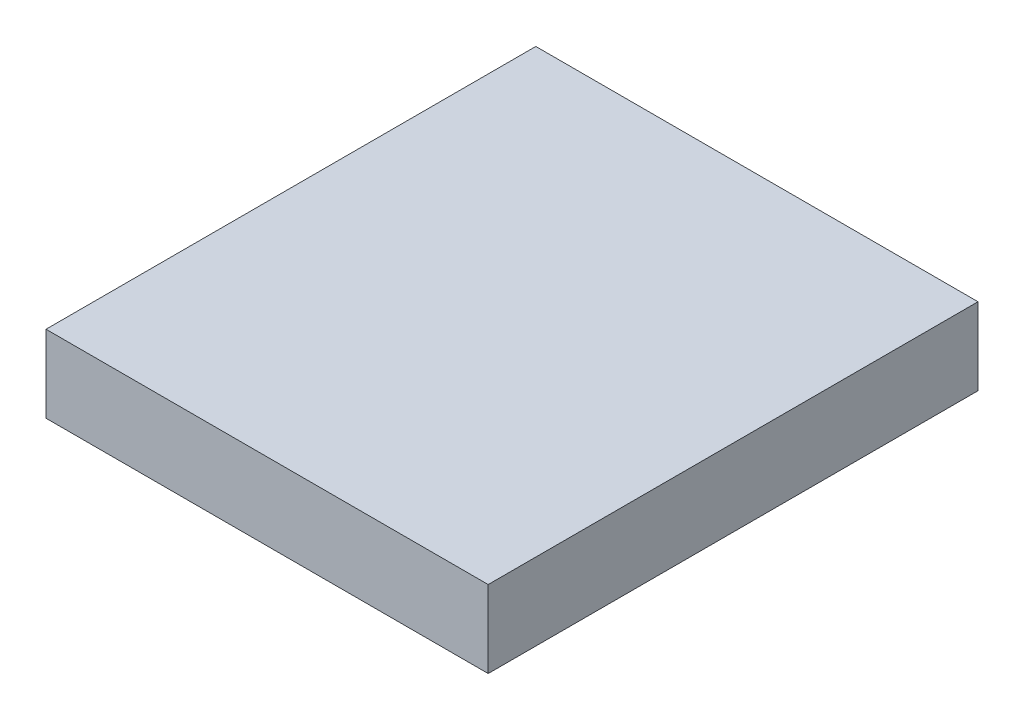
ISO-10303-21;
HEADER;
FILE_DESCRIPTION(('STEP AP214'),'2;1');
FILE_NAME('part.step','',(''),(''),'','','');
FILE_SCHEMA(('AUTOMOTIVE_DESIGN { 1 0 10303 214 1 1 1 1 }'));
ENDSEC;
DATA;
#1=APPLICATION_CONTEXT('core data for automotive mechanical design processes');
#2=APPLICATION_PROTOCOL_DEFINITION('international standard','automotive_design',2000,#1);
#3=PRODUCT_CONTEXT('',#1,'mechanical');
#4=PRODUCT('Part','Part','',(#3));
#5=PRODUCT_RELATED_PRODUCT_CATEGORY('part','',(#4));
#6=PRODUCT_DEFINITION_FORMATION('','',#4);
#7=PRODUCT_DEFINITION_CONTEXT('part definition',#1,'design');
#8=PRODUCT_DEFINITION('design','',#6,#7);
#9=PRODUCT_DEFINITION_SHAPE('','',#8);
#10=(LENGTH_UNIT() NAMED_UNIT(*) SI_UNIT(.MILLI.,.METRE.));
#11=(NAMED_UNIT(*) PLANE_ANGLE_UNIT() SI_UNIT($,.RADIAN.));
#12=(NAMED_UNIT(*) SI_UNIT($,.STERADIAN.) SOLID_ANGLE_UNIT());
#13=UNCERTAINTY_MEASURE_WITH_UNIT(LENGTH_MEASURE(1.E-05),#10,'distance_accuracy_value','');
#14=(GEOMETRIC_REPRESENTATION_CONTEXT(3) GLOBAL_UNCERTAINTY_ASSIGNED_CONTEXT((#13)) GLOBAL_UNIT_ASSIGNED_CONTEXT((#10,
#11,#12)) REPRESENTATION_CONTEXT('',''));
#15=CARTESIAN_POINT('',(0.,0.,0.));
#16=DIRECTION('',(0.,0.,1.));
#17=DIRECTION('',(1.,0.,0.));
#18=AXIS2_PLACEMENT_3D('',#15,#16,#17);
#19=CARTESIAN_POINT('',(-25.197786407767,8.636,-9.32895145631068));
#20=DIRECTION('',(1.,0.,0.));
#21=DIRECTION('',(0.,0.,-1.));
#22=AXIS2_PLACEMENT_3D('',#19,#20,#21);
#23=PLANE('',#22);
#24=DIRECTION('',(0.,0.,1.));
#25=VECTOR('',#24,1.);
#26=CARTESIAN_POINT('',(-25.197786407767,0.,-9.32895145631068));
#27=LINE('',#26,#25);
#28=CARTESIAN_POINT('',(-25.197786407767,0.,-9.32895145631068));
#29=VERTEX_POINT('',#28);
#30=CARTESIAN_POINT('',(-25.197786407767,0.,45.5350485436893));
#31=VERTEX_POINT('',#30);
#32=EDGE_CURVE('E96',#29,#31,#27,.T.);
#33=ORIENTED_EDGE('',*,*,#32,.T.);
#34=DIRECTION('',(0.,-1.,0.));
#35=VECTOR('',#34,1.);
#36=CARTESIAN_POINT('',(-25.197786407767,8.636,45.5350485436893));
#37=LINE('',#36,#35);
#38=CARTESIAN_POINT('',(-25.197786407767,8.636,45.5350485436893));
#39=VERTEX_POINT('',#38);
#40=EDGE_CURVE('E11',#39,#31,#37,.T.);
#41=ORIENTED_EDGE('',*,*,#40,.F.);
#42=DIRECTION('',(0.,0.,1.));
#43=VECTOR('',#42,1.);
#44=CARTESIAN_POINT('',(-25.197786407767,8.636,-9.32895145631068));
#45=LINE('',#44,#43);
#46=CARTESIAN_POINT('',(-25.197786407767,8.636,-9.32895145631068));
#47=VERTEX_POINT('',#46);
#48=EDGE_CURVE('E84',#47,#39,#45,.T.);
#49=ORIENTED_EDGE('',*,*,#48,.F.);
#50=DIRECTION('',(0.,-1.,0.));
#51=VECTOR('',#50,1.);
#52=CARTESIAN_POINT('',(-25.197786407767,8.636,-9.32895145631068));
#53=LINE('',#52,#51);
#54=EDGE_CURVE('E92',#47,#29,#53,.T.);
#55=ORIENTED_EDGE('',*,*,#54,.T.);
#56=EDGE_LOOP('',(#33,#41,#49,#55));
#57=FACE_BOUND('',#56,.T.);
#58=ADVANCED_FACE('F33',(#57),#23,.F.);
#59=CARTESIAN_POINT('',(-25.197786407767,8.636,45.5350485436893));
#60=DIRECTION('',(0.,0.,-1.));
#61=DIRECTION('',(-1.,0.,0.));
#62=AXIS2_PLACEMENT_3D('',#59,#60,#61);
#63=PLANE('',#62);
#64=DIRECTION('',(1.,0.,0.));
#65=VECTOR('',#64,1.);
#66=CARTESIAN_POINT('',(-25.197786407767,0.,45.5350485436893));
#67=LINE('',#66,#65);
#68=CARTESIAN_POINT('',(24.332213592233,0.,45.5350485436893));
#69=VERTEX_POINT('',#68);
#70=EDGE_CURVE('E88',#31,#69,#67,.T.);
#71=ORIENTED_EDGE('',*,*,#70,.T.);
#72=DIRECTION('',(0.,-1.,0.));
#73=VECTOR('',#72,1.);
#74=CARTESIAN_POINT('',(24.332213592233,8.636,45.5350485436893));
#75=LINE('',#74,#73);
#76=CARTESIAN_POINT('',(24.332213592233,8.636,45.5350485436893));
#77=VERTEX_POINT('',#76);
#78=EDGE_CURVE('E41',#77,#69,#75,.T.);
#79=ORIENTED_EDGE('',*,*,#78,.F.);
#80=DIRECTION('',(1.,0.,0.));
#81=VECTOR('',#80,1.);
#82=CARTESIAN_POINT('',(-25.197786407767,8.636,45.5350485436893));
#83=LINE('',#82,#81);
#84=EDGE_CURVE('E79',#39,#77,#83,.T.);
#85=ORIENTED_EDGE('',*,*,#84,.F.);
#86=ORIENTED_EDGE('',*,*,#40,.T.);
#87=EDGE_LOOP('',(#71,#79,#85,#86));
#88=FACE_BOUND('',#87,.T.);
#89=ADVANCED_FACE('F87',(#88),#63,.F.);
#90=CARTESIAN_POINT('',(24.332213592233,8.636,-9.32895145631068));
#91=DIRECTION('',(-1.,0.,0.));
#92=DIRECTION('',(0.,0.,1.));
#93=AXIS2_PLACEMENT_3D('',#90,#91,#92);
#94=PLANE('',#93);
#95=DIRECTION('',(0.,0.,-1.));
#96=VECTOR('',#95,1.);
#97=CARTESIAN_POINT('',(24.332213592233,0.,-9.32895145631068));
#98=LINE('',#97,#96);
#99=CARTESIAN_POINT('',(24.332213592233,0.,-9.32895145631068));
#100=VERTEX_POINT('',#99);
#101=EDGE_CURVE('E66',#69,#100,#98,.T.);
#102=ORIENTED_EDGE('',*,*,#101,.T.);
#103=DIRECTION('',(0.,-1.,0.));
#104=VECTOR('',#103,1.);
#105=CARTESIAN_POINT('',(24.332213592233,8.636,-9.32895145631068));
#106=LINE('',#105,#104);
#107=CARTESIAN_POINT('',(24.332213592233,8.636,-9.32895145631068));
#108=VERTEX_POINT('',#107);
#109=EDGE_CURVE('E89',#108,#100,#106,.T.);
#110=ORIENTED_EDGE('',*,*,#109,.F.);
#111=DIRECTION('',(0.,0.,-1.));
#112=VECTOR('',#111,1.);
#113=CARTESIAN_POINT('',(24.332213592233,8.636,-9.32895145631068));
#114=LINE('',#113,#112);
#115=EDGE_CURVE('E82',#77,#108,#114,.T.);
#116=ORIENTED_EDGE('',*,*,#115,.F.);
#117=ORIENTED_EDGE('',*,*,#78,.T.);
#118=EDGE_LOOP('',(#102,#110,#116,#117));
#119=FACE_BOUND('',#118,.T.);
#120=ADVANCED_FACE('F90',(#119),#94,.F.);
#121=CARTESIAN_POINT('',(-25.197786407767,8.636,-9.32895145631068));
#122=DIRECTION('',(0.,0.,1.));
#123=DIRECTION('',(1.,0.,0.));
#124=AXIS2_PLACEMENT_3D('',#121,#122,#123);
#125=PLANE('',#124);
#126=DIRECTION('',(-1.,0.,0.));
#127=VECTOR('',#126,1.);
#128=CARTESIAN_POINT('',(-25.197786407767,0.,-9.32895145631068));
#129=LINE('',#128,#127);
#130=EDGE_CURVE('E72',#100,#29,#129,.T.);
#131=ORIENTED_EDGE('',*,*,#130,.T.);
#132=ORIENTED_EDGE('',*,*,#54,.F.);
#133=DIRECTION('',(-1.,0.,0.));
#134=VECTOR('',#133,1.);
#135=CARTESIAN_POINT('',(-25.197786407767,8.636,-9.32895145631068));
#136=LINE('',#135,#134);
#137=EDGE_CURVE('E49',#108,#47,#136,.T.);
#138=ORIENTED_EDGE('',*,*,#137,.F.);
#139=ORIENTED_EDGE('',*,*,#109,.T.);
#140=EDGE_LOOP('',(#131,#132,#138,#139));
#141=FACE_BOUND('',#140,.T.);
#142=ADVANCED_FACE('F103',(#141),#125,.F.);
#143=CARTESIAN_POINT('',(0.,8.636,0.));
#144=DIRECTION('',(0.,1.,0.));
#145=DIRECTION('',(0.,0.,1.));
#146=AXIS2_PLACEMENT_3D('',#143,#144,#145);
#147=PLANE('',#146);
#148=ORIENTED_EDGE('',*,*,#48,.T.);
#149=ORIENTED_EDGE('',*,*,#84,.T.);
#150=ORIENTED_EDGE('',*,*,#115,.T.);
#151=ORIENTED_EDGE('',*,*,#137,.T.);
#152=EDGE_LOOP('',(#148,#149,#150,#151));
#153=FACE_BOUND('',#152,.T.);
#154=ADVANCED_FACE('F80',(#153),#147,.T.);
#155=CARTESIAN_POINT('',(0.,0.,0.));
#156=DIRECTION('',(0.,1.,0.));
#157=DIRECTION('',(0.,0.,1.));
#158=AXIS2_PLACEMENT_3D('',#155,#156,#157);
#159=PLANE('',#158);
#160=ORIENTED_EDGE('',*,*,#32,.F.);
#161=ORIENTED_EDGE('',*,*,#130,.F.);
#162=ORIENTED_EDGE('',*,*,#101,.F.);
#163=ORIENTED_EDGE('',*,*,#70,.F.);
#164=EDGE_LOOP('',(#160,#161,#162,#163));
#165=FACE_BOUND('',#164,.T.);
#166=ADVANCED_FACE('F106',(#165),#159,.F.);
#167=CLOSED_SHELL('',(#58,#89,#120,#142,#154,#166));
#168=MANIFOLD_SOLID_BREP('B2',#167);
#169=ADVANCED_BREP_SHAPE_REPRESENTATION('',(#18,#168),#14);
#170=SHAPE_DEFINITION_REPRESENTATION(#9,#169);
ENDSEC;
END-ISO-10303-21;
